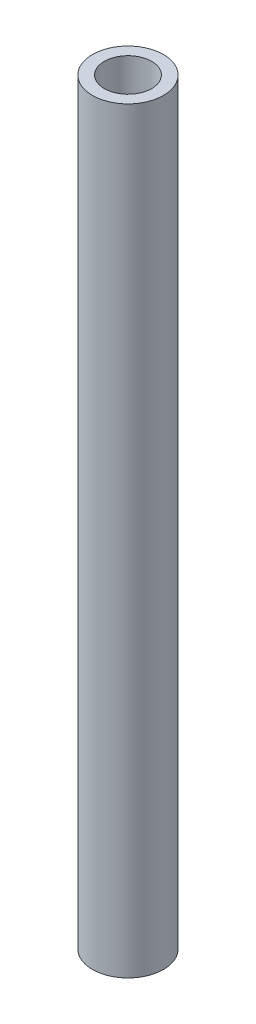
ISO-10303-21;
HEADER;
FILE_DESCRIPTION(('STEP AP214'),'2;1');
FILE_NAME('part.step','',(''),(''),'','','');
FILE_SCHEMA(('AUTOMOTIVE_DESIGN { 1 0 10303 214 1 1 1 1 }'));
ENDSEC;
DATA;
#1=APPLICATION_CONTEXT('core data for automotive mechanical design processes');
#2=APPLICATION_PROTOCOL_DEFINITION('international standard','automotive_design',2000,#1);
#3=PRODUCT_CONTEXT('',#1,'mechanical');
#4=PRODUCT('Part','Part','',(#3));
#5=PRODUCT_RELATED_PRODUCT_CATEGORY('part','',(#4));
#6=PRODUCT_DEFINITION_FORMATION('','',#4);
#7=PRODUCT_DEFINITION_CONTEXT('part definition',#1,'design');
#8=PRODUCT_DEFINITION('design','',#6,#7);
#9=PRODUCT_DEFINITION_SHAPE('','',#8);
#10=(LENGTH_UNIT() NAMED_UNIT(*) SI_UNIT(.MILLI.,.METRE.));
#11=(NAMED_UNIT(*) PLANE_ANGLE_UNIT() SI_UNIT($,.RADIAN.));
#12=(NAMED_UNIT(*) SI_UNIT($,.STERADIAN.) SOLID_ANGLE_UNIT());
#13=UNCERTAINTY_MEASURE_WITH_UNIT(LENGTH_MEASURE(1.E-05),#10,'distance_accuracy_value','');
#14=(GEOMETRIC_REPRESENTATION_CONTEXT(3) GLOBAL_UNCERTAINTY_ASSIGNED_CONTEXT((#13)) GLOBAL_UNIT_ASSIGNED_CONTEXT((#10,
#11,#12)) REPRESENTATION_CONTEXT('',''));
#15=CARTESIAN_POINT('',(0.,0.,0.));
#16=DIRECTION('',(0.,0.,1.));
#17=DIRECTION('',(1.,0.,0.));
#18=AXIS2_PLACEMENT_3D('',#15,#16,#17);
#19=CARTESIAN_POINT('',(0.,101.6,0.));
#20=DIRECTION('',(0.,1.,0.));
#21=DIRECTION('',(0.,0.,1.));
#22=AXIS2_PLACEMENT_3D('',#19,#20,#21);
#23=PLANE('',#22);
#24=CARTESIAN_POINT('',(0.,101.6,0.));
#25=DIRECTION('',(0.,1.,0.));
#26=DIRECTION('',(0.,0.,1.));
#27=AXIS2_PLACEMENT_3D('',#24,#25,#26);
#28=CIRCLE('',#27,4.7625);
#29=CARTESIAN_POINT('',(0.,101.6,4.7625));
#30=VERTEX_POINT('',#29);
#31=EDGE_CURVE('E10',#30,#30,#28,.T.);
#32=ORIENTED_EDGE('',*,*,#31,.T.);
#33=EDGE_LOOP('',(#32));
#34=FACE_BOUND('',#33,.T.);
#35=CARTESIAN_POINT('',(0.,101.6,0.));
#36=DIRECTION('',(0.,1.,0.));
#37=DIRECTION('',(0.,0.,1.));
#38=AXIS2_PLACEMENT_3D('',#35,#36,#37);
#39=CIRCLE('',#38,3.175);
#40=CARTESIAN_POINT('',(0.,101.6,3.175));
#41=VERTEX_POINT('',#40);
#42=EDGE_CURVE('E42',#41,#41,#39,.T.);
#43=ORIENTED_EDGE('',*,*,#42,.F.);
#44=EDGE_LOOP('',(#43));
#45=FACE_BOUND('',#44,.T.);
#46=ADVANCED_FACE('F31',(#34,#45),#23,.T.);
#47=CARTESIAN_POINT('',(0.,0.,0.));
#48=DIRECTION('',(0.,1.,0.));
#49=DIRECTION('',(0.,0.,1.));
#50=AXIS2_PLACEMENT_3D('',#47,#48,#49);
#51=PLANE('',#50);
#52=CARTESIAN_POINT('',(0.,0.,0.));
#53=DIRECTION('',(0.,1.,0.));
#54=DIRECTION('',(0.,0.,1.));
#55=AXIS2_PLACEMENT_3D('',#52,#53,#54);
#56=CIRCLE('',#55,4.7625);
#57=CARTESIAN_POINT('',(0.,0.,4.7625));
#58=VERTEX_POINT('',#57);
#59=EDGE_CURVE('E35',#58,#58,#56,.T.);
#60=ORIENTED_EDGE('',*,*,#59,.F.);
#61=EDGE_LOOP('',(#60));
#62=FACE_BOUND('',#61,.T.);
#63=CARTESIAN_POINT('',(0.,0.,0.));
#64=DIRECTION('',(0.,1.,0.));
#65=DIRECTION('',(0.,0.,1.));
#66=AXIS2_PLACEMENT_3D('',#63,#64,#65);
#67=CIRCLE('',#66,3.175);
#68=CARTESIAN_POINT('',(0.,0.,3.175));
#69=VERTEX_POINT('',#68);
#70=EDGE_CURVE('E44',#69,#69,#67,.T.);
#71=ORIENTED_EDGE('',*,*,#70,.T.);
#72=EDGE_LOOP('',(#71));
#73=FACE_BOUND('',#72,.T.);
#74=ADVANCED_FACE('F54',(#62,#73),#51,.F.);
#75=CARTESIAN_POINT('',(0.,101.6,0.));
#76=DIRECTION('',(0.,-1.,0.));
#77=DIRECTION('',(0.,0.,-1.));
#78=AXIS2_PLACEMENT_3D('',#75,#76,#77);
#79=CYLINDRICAL_SURFACE('',#78,4.7625);
#80=ORIENTED_EDGE('',*,*,#31,.F.);
#81=EDGE_LOOP('',(#80));
#82=FACE_BOUND('',#81,.T.);
#83=ORIENTED_EDGE('',*,*,#59,.T.);
#84=EDGE_LOOP('',(#83));
#85=FACE_BOUND('',#84,.T.);
#86=ADVANCED_FACE('F33',(#82,#85),#79,.T.);
#87=CARTESIAN_POINT('',(0.,101.6,0.));
#88=DIRECTION('',(0.,-1.,0.));
#89=DIRECTION('',(0.,0.,-1.));
#90=AXIS2_PLACEMENT_3D('',#87,#88,#89);
#91=CYLINDRICAL_SURFACE('',#90,3.175);
#92=ORIENTED_EDGE('',*,*,#42,.T.);
#93=EDGE_LOOP('',(#92));
#94=FACE_BOUND('',#93,.T.);
#95=ORIENTED_EDGE('',*,*,#70,.F.);
#96=EDGE_LOOP('',(#95));
#97=FACE_BOUND('',#96,.T.);
#98=ADVANCED_FACE('F50',(#94,#97),#91,.F.);
#99=CLOSED_SHELL('',(#46,#74,#86,#98));
#100=MANIFOLD_SOLID_BREP('B2',#99);
#101=ADVANCED_BREP_SHAPE_REPRESENTATION('',(#18,#100),#14);
#102=SHAPE_DEFINITION_REPRESENTATION(#9,#101);
ENDSEC;
END-ISO-10303-21;
